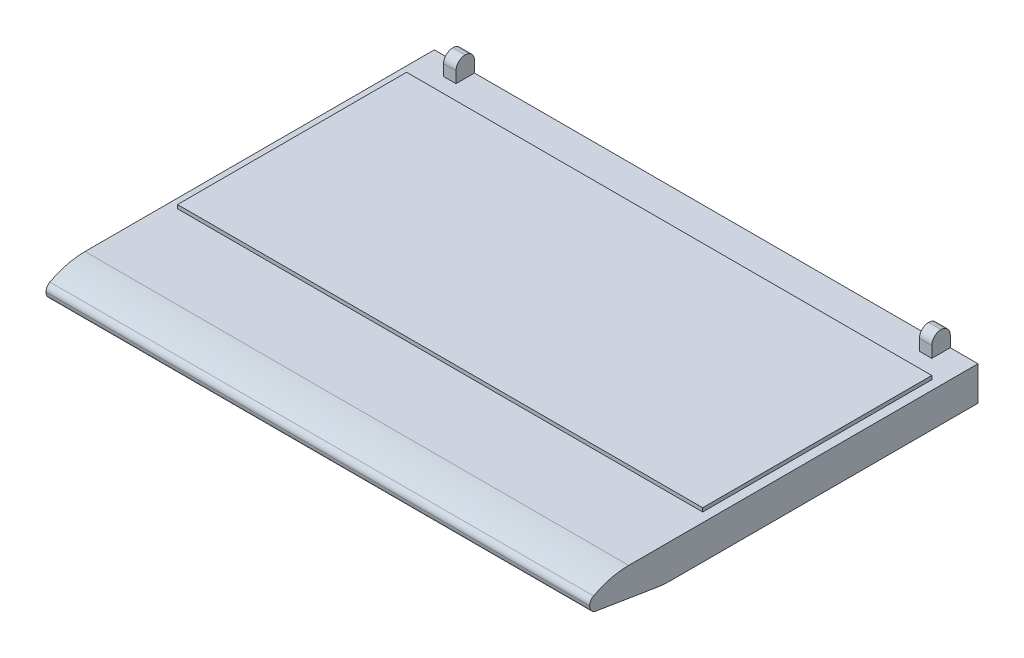
ISO-10303-21;
HEADER;
FILE_DESCRIPTION(('STEP AP214'),'2;1');
FILE_NAME('part.step','',(''),(''),'','','');
FILE_SCHEMA(('AUTOMOTIVE_DESIGN { 1 0 10303 214 1 1 1 1 }'));
ENDSEC;
DATA;
#1=APPLICATION_CONTEXT('core data for automotive mechanical design processes');
#2=APPLICATION_PROTOCOL_DEFINITION('international standard','automotive_design',2000,#1);
#3=PRODUCT_CONTEXT('',#1,'mechanical');
#4=PRODUCT('Part','Part','',(#3));
#5=PRODUCT_RELATED_PRODUCT_CATEGORY('part','',(#4));
#6=PRODUCT_DEFINITION_FORMATION('','',#4);
#7=PRODUCT_DEFINITION_CONTEXT('part definition',#1,'design');
#8=PRODUCT_DEFINITION('design','',#6,#7);
#9=PRODUCT_DEFINITION_SHAPE('','',#8);
#10=(LENGTH_UNIT() NAMED_UNIT(*) SI_UNIT(.MILLI.,.METRE.));
#11=(NAMED_UNIT(*) PLANE_ANGLE_UNIT() SI_UNIT($,.RADIAN.));
#12=(NAMED_UNIT(*) SI_UNIT($,.STERADIAN.) SOLID_ANGLE_UNIT());
#13=UNCERTAINTY_MEASURE_WITH_UNIT(LENGTH_MEASURE(1.E-05),#10,'distance_accuracy_value','');
#14=(GEOMETRIC_REPRESENTATION_CONTEXT(3) GLOBAL_UNCERTAINTY_ASSIGNED_CONTEXT((#13)) GLOBAL_UNIT_ASSIGNED_CONTEXT((#10,
#11,#12)) REPRESENTATION_CONTEXT('',''));
#15=CARTESIAN_POINT('',(0.,0.,0.));
#16=DIRECTION('',(0.,0.,1.));
#17=DIRECTION('',(1.,0.,0.));
#18=AXIS2_PLACEMENT_3D('',#15,#16,#17);
#19=CARTESIAN_POINT('',(147.,18.5,105.));
#20=DIRECTION('',(0.,-1.,0.));
#21=DIRECTION('',(0.,0.,-1.));
#22=AXIS2_PLACEMENT_3D('',#19,#20,#21);
#23=PLANE('',#22);
#24=DIRECTION('',(0.,0.,1.));
#25=VECTOR('',#24,1.);
#26=CARTESIAN_POINT('',(-132.,18.5,-105.));
#27=LINE('',#26,#25);
#28=CARTESIAN_POINT('',(-132.,18.5,-105.));
#29=VERTEX_POINT('',#28);
#30=CARTESIAN_POINT('',(-132.,18.5,-95.));
#31=VERTEX_POINT('',#30);
#32=EDGE_CURVE('E216',#29,#31,#27,.T.);
#33=ORIENTED_EDGE('',*,*,#32,.F.);
#34=DIRECTION('',(-1.,0.,0.));
#35=VECTOR('',#34,1.);
#36=CARTESIAN_POINT('',(147.,18.5,-105.));
#37=LINE('',#36,#35);
#38=CARTESIAN_POINT('',(-147.,18.5,-105.));
#39=VERTEX_POINT('',#38);
#40=EDGE_CURVE('E257',#29,#39,#37,.T.);
#41=ORIENTED_EDGE('',*,*,#40,.T.);
#42=DIRECTION('',(0.,0.,1.));
#43=VECTOR('',#42,1.);
#44=CARTESIAN_POINT('',(-147.,18.5,-105.));
#45=LINE('',#44,#43);
#46=CARTESIAN_POINT('',(-147.,18.5,83.8897274573419));
#47=VERTEX_POINT('',#46);
#48=EDGE_CURVE('E262',#39,#47,#45,.T.);
#49=ORIENTED_EDGE('',*,*,#48,.T.);
#50=DIRECTION('',(-1.,0.,0.));
#51=VECTOR('',#50,1.);
#52=CARTESIAN_POINT('',(147.,18.5,83.8897274573419));
#53=LINE('',#52,#51);
#54=CARTESIAN_POINT('',(147.,18.5,83.8897274573419));
#55=VERTEX_POINT('',#54);
#56=EDGE_CURVE('E283',#47,#55,#53,.F.);
#57=ORIENTED_EDGE('',*,*,#56,.T.);
#58=DIRECTION('',(0.,0.,-1.));
#59=VECTOR('',#58,1.);
#60=CARTESIAN_POINT('',(147.,18.5,-105.));
#61=LINE('',#60,#59);
#62=CARTESIAN_POINT('',(147.,18.5,-105.));
#63=VERTEX_POINT('',#62);
#64=EDGE_CURVE('E255',#55,#63,#61,.T.);
#65=ORIENTED_EDGE('',*,*,#64,.T.);
#66=CARTESIAN_POINT('',(132.,18.5,-105.));
#67=VERTEX_POINT('',#66);
#68=EDGE_CURVE('E259',#63,#67,#37,.T.);
#69=ORIENTED_EDGE('',*,*,#68,.T.);
#70=DIRECTION('',(0.,0.,-1.));
#71=VECTOR('',#70,1.);
#72=CARTESIAN_POINT('',(132.,18.5,-105.));
#73=LINE('',#72,#71);
#74=CARTESIAN_POINT('',(132.,18.5,-95.));
#75=VERTEX_POINT('',#74);
#76=EDGE_CURVE('E239',#75,#67,#73,.T.);
#77=ORIENTED_EDGE('',*,*,#76,.F.);
#78=DIRECTION('',(1.,0.,0.));
#79=VECTOR('',#78,1.);
#80=CARTESIAN_POINT('',(125.3,18.5,-95.0000000000001));
#81=LINE('',#80,#79);
#82=CARTESIAN_POINT('',(125.3,18.5,-95.0000000000001));
#83=VERTEX_POINT('',#82);
#84=EDGE_CURVE('E236',#83,#75,#81,.T.);
#85=ORIENTED_EDGE('',*,*,#84,.F.);
#86=DIRECTION('',(0.,0.,1.));
#87=VECTOR('',#86,1.);
#88=CARTESIAN_POINT('',(125.3,18.5,-105.));
#89=LINE('',#88,#87);
#90=CARTESIAN_POINT('',(125.3,18.5,-105.));
#91=VERTEX_POINT('',#90);
#92=EDGE_CURVE('E233',#91,#83,#89,.T.);
#93=ORIENTED_EDGE('',*,*,#92,.F.);
#94=CARTESIAN_POINT('',(-125.3,18.5,-105.));
#95=VERTEX_POINT('',#94);
#96=EDGE_CURVE('E263',#91,#95,#37,.T.);
#97=ORIENTED_EDGE('',*,*,#96,.T.);
#98=DIRECTION('',(0.,0.,-1.));
#99=VECTOR('',#98,1.);
#100=CARTESIAN_POINT('',(-125.3,18.5,-105.));
#101=LINE('',#100,#99);
#102=CARTESIAN_POINT('',(-125.3,18.5,-95.));
#103=VERTEX_POINT('',#102);
#104=EDGE_CURVE('E222',#103,#95,#101,.T.);
#105=ORIENTED_EDGE('',*,*,#104,.F.);
#106=DIRECTION('',(1.,0.,0.));
#107=VECTOR('',#106,1.);
#108=CARTESIAN_POINT('',(-125.3,18.5,-95.));
#109=LINE('',#108,#107);
#110=EDGE_CURVE('E219',#31,#103,#109,.T.);
#111=ORIENTED_EDGE('',*,*,#110,.F.);
#112=EDGE_LOOP('',(#33,#41,#49,#57,#65,#69,#77,#85,#93,#97,#105,#111));
#113=FACE_BOUND('',#112,.T.);
#114=DIRECTION('',(0.,0.,1.));
#115=VECTOR('',#114,1.);
#116=CARTESIAN_POINT('',(-142.,18.5,-85.));
#117=LINE('',#116,#115);
#118=CARTESIAN_POINT('',(-142.,18.5,-85.));
#119=VERTEX_POINT('',#118);
#120=CARTESIAN_POINT('',(-142.,18.5,38.8897274573419));
#121=VERTEX_POINT('',#120);
#122=EDGE_CURVE('E208',#119,#121,#117,.T.);
#123=ORIENTED_EDGE('',*,*,#122,.F.);
#124=DIRECTION('',(-1.,0.,0.));
#125=VECTOR('',#124,1.);
#126=CARTESIAN_POINT('',(-142.,18.5,-85.));
#127=LINE('',#126,#125);
#128=CARTESIAN_POINT('',(142.,18.5,-85.0000000000001));
#129=VERTEX_POINT('',#128);
#130=EDGE_CURVE('E205',#129,#119,#127,.T.);
#131=ORIENTED_EDGE('',*,*,#130,.F.);
#132=DIRECTION('',(0.,0.,-1.));
#133=VECTOR('',#132,1.);
#134=CARTESIAN_POINT('',(142.,18.5,-85.));
#135=LINE('',#134,#133);
#136=CARTESIAN_POINT('',(142.,18.5,38.8897274573419));
#137=VERTEX_POINT('',#136);
#138=EDGE_CURVE('E54',#137,#129,#135,.T.);
#139=ORIENTED_EDGE('',*,*,#138,.F.);
#140=DIRECTION('',(1.,0.,0.));
#141=VECTOR('',#140,1.);
#142=CARTESIAN_POINT('',(-142.,18.5,38.8897274573419));
#143=LINE('',#142,#141);
#144=EDGE_CURVE('E49',#121,#137,#143,.T.);
#145=ORIENTED_EDGE('',*,*,#144,.F.);
#146=EDGE_LOOP('',(#123,#131,#139,#145));
#147=FACE_BOUND('',#146,.T.);
#148=ADVANCED_FACE('F32',(#113,#147),#23,.F.);
#149=CARTESIAN_POINT('',(147.,18.5,-105.));
#150=DIRECTION('',(-1.,0.,0.));
#151=DIRECTION('',(0.,0.,1.));
#152=AXIS2_PLACEMENT_3D('',#149,#150,#151);
#153=PLANE('',#152);
#154=DIRECTION('',(0.,0.160396069376391,0.987052734623943));
#155=VECTOR('',#154,1.);
#156=CARTESIAN_POINT('',(147.,6.5,105.));
#157=LINE('',#156,#155);
#158=CARTESIAN_POINT('',(147.,0.647363268802846,68.9837739618637));
#159=VERTEX_POINT('',#158);
#160=CARTESIAN_POINT('',(147.,5.95425744509465,101.641584277506));
#161=VERTEX_POINT('',#160);
#162=EDGE_CURVE('E250',#159,#161,#157,.T.);
#163=ORIENTED_EDGE('',*,*,#162,.F.);
#164=CARTESIAN_POINT('',(147.,50.,60.9639704930441));
#165=DIRECTION('',(-1.,0.,0.));
#166=DIRECTION('',(0.,0.,1.));
#167=AXIS2_PLACEMENT_3D('',#164,#165,#166);
#168=CIRCLE('',#167,50.);
#169=CARTESIAN_POINT('',(147.,0.,60.9639704930441));
#170=VERTEX_POINT('',#169);
#171=EDGE_CURVE('E314',#159,#170,#168,.F.);
#172=ORIENTED_EDGE('',*,*,#171,.T.);
#173=DIRECTION('',(0.,0.,-1.));
#174=VECTOR('',#173,1.);
#175=CARTESIAN_POINT('',(147.,0.,-105.));
#176=LINE('',#175,#174);
#177=CARTESIAN_POINT('',(147.,0.,-105.));
#178=VERTEX_POINT('',#177);
#179=EDGE_CURVE('E254',#170,#178,#176,.T.);
#180=ORIENTED_EDGE('',*,*,#179,.T.);
#181=DIRECTION('',(0.,-1.,0.));
#182=VECTOR('',#181,1.);
#183=CARTESIAN_POINT('',(147.,18.5,-105.));
#184=LINE('',#183,#182);
#185=EDGE_CURVE('E280',#63,#178,#184,.T.);
#186=ORIENTED_EDGE('',*,*,#185,.F.);
#187=ORIENTED_EDGE('',*,*,#64,.F.);
#188=CARTESIAN_POINT('',(147.,-21.5,83.8897274573419));
#189=DIRECTION('',(-1.,0.,0.));
#190=DIRECTION('',(0.,0.,1.));
#191=AXIS2_PLACEMENT_3D('',#188,#189,#190);
#192=CIRCLE('',#191,40.);
#193=CARTESIAN_POINT('',(147.,13.693268392452,102.901141393629));
#194=VERTEX_POINT('',#193);
#195=EDGE_CURVE('E286',#55,#194,#192,.F.);
#196=ORIENTED_EDGE('',*,*,#195,.T.);
#197=CARTESIAN_POINT('',(147.,10.1739415532068,101.));
#198=DIRECTION('',(-1.,0.,0.));
#199=DIRECTION('',(0.,0.,1.));
#200=AXIS2_PLACEMENT_3D('',#197,#198,#199);
#201=CIRCLE('',#200,4.);
#202=CARTESIAN_POINT('',(147.,10.1739415532068,105.));
#203=VERTEX_POINT('',#202);
#204=EDGE_CURVE('E297',#194,#203,#201,.F.);
#205=ORIENTED_EDGE('',*,*,#204,.T.);
#206=DIRECTION('',(0.,-1.,0.));
#207=VECTOR('',#206,1.);
#208=CARTESIAN_POINT('',(147.,18.5,105.));
#209=LINE('',#208,#207);
#210=CARTESIAN_POINT('',(147.,9.90246838359042,105.));
#211=VERTEX_POINT('',#210);
#212=EDGE_CURVE('E266',#203,#211,#209,.T.);
#213=ORIENTED_EDGE('',*,*,#212,.T.);
#214=CARTESIAN_POINT('',(147.,9.90246838359042,101.));
#215=DIRECTION('',(-1.,0.,0.));
#216=DIRECTION('',(0.,0.,1.));
#217=AXIS2_PLACEMENT_3D('',#214,#215,#216);
#218=CIRCLE('',#217,4.);
#219=EDGE_CURVE('E299',#211,#161,#218,.F.);
#220=ORIENTED_EDGE('',*,*,#219,.T.);
#221=EDGE_LOOP('',(#163,#172,#180,#186,#187,#196,#205,#213,#220));
#222=FACE_BOUND('',#221,.T.);
#223=ADVANCED_FACE('F408',(#222),#153,.F.);
#224=CARTESIAN_POINT('',(147.,18.5,-105.));
#225=DIRECTION('',(0.,0.,1.));
#226=DIRECTION('',(1.,0.,0.));
#227=AXIS2_PLACEMENT_3D('',#224,#225,#226);
#228=PLANE('',#227);
#229=DIRECTION('',(0.,-1.,0.));
#230=VECTOR('',#229,1.);
#231=CARTESIAN_POINT('',(-132.,29.5,-105.));
#232=LINE('',#231,#230);
#233=CARTESIAN_POINT('',(-132.,24.5,-105.));
#234=VERTEX_POINT('',#233);
#235=EDGE_CURVE('E231',#234,#29,#232,.T.);
#236=ORIENTED_EDGE('',*,*,#235,.F.);
#237=DIRECTION('',(-1.,0.,0.));
#238=VECTOR('',#237,1.);
#239=CARTESIAN_POINT('',(-125.3,24.5,-105.));
#240=LINE('',#239,#238);
#241=CARTESIAN_POINT('',(-125.3,24.5,-105.));
#242=VERTEX_POINT('',#241);
#243=EDGE_CURVE('E327',#234,#242,#240,.F.);
#244=ORIENTED_EDGE('',*,*,#243,.T.);
#245=DIRECTION('',(0.,-1.,0.));
#246=VECTOR('',#245,1.);
#247=CARTESIAN_POINT('',(-125.3,29.5,-105.));
#248=LINE('',#247,#246);
#249=EDGE_CURVE('E225',#242,#95,#248,.T.);
#250=ORIENTED_EDGE('',*,*,#249,.T.);
#251=ORIENTED_EDGE('',*,*,#96,.F.);
#252=DIRECTION('',(0.,-1.,0.));
#253=VECTOR('',#252,1.);
#254=CARTESIAN_POINT('',(125.3,29.5,-105.));
#255=LINE('',#254,#253);
#256=CARTESIAN_POINT('',(125.3,24.5,-105.));
#257=VERTEX_POINT('',#256);
#258=EDGE_CURVE('E242',#257,#91,#255,.T.);
#259=ORIENTED_EDGE('',*,*,#258,.F.);
#260=DIRECTION('',(-1.,0.,0.));
#261=VECTOR('',#260,1.);
#262=CARTESIAN_POINT('',(132.,24.5,-105.));
#263=LINE('',#262,#261);
#264=CARTESIAN_POINT('',(132.,24.5,-105.));
#265=VERTEX_POINT('',#264);
#266=EDGE_CURVE('E324',#257,#265,#263,.F.);
#267=ORIENTED_EDGE('',*,*,#266,.T.);
#268=DIRECTION('',(0.,-1.,0.));
#269=VECTOR('',#268,1.);
#270=CARTESIAN_POINT('',(132.,29.5,-105.));
#271=LINE('',#270,#269);
#272=EDGE_CURVE('E244',#265,#67,#271,.T.);
#273=ORIENTED_EDGE('',*,*,#272,.T.);
#274=ORIENTED_EDGE('',*,*,#68,.F.);
#275=ORIENTED_EDGE('',*,*,#185,.T.);
#276=DIRECTION('',(-1.,0.,0.));
#277=VECTOR('',#276,1.);
#278=CARTESIAN_POINT('',(147.,0.,-105.));
#279=LINE('',#278,#277);
#280=CARTESIAN_POINT('',(-147.,0.,-105.));
#281=VERTEX_POINT('',#280);
#282=EDGE_CURVE('E268',#178,#281,#279,.T.);
#283=ORIENTED_EDGE('',*,*,#282,.T.);
#284=DIRECTION('',(0.,-1.,0.));
#285=VECTOR('',#284,1.);
#286=CARTESIAN_POINT('',(-147.,18.5,-105.));
#287=LINE('',#286,#285);
#288=EDGE_CURVE('E277',#39,#281,#287,.T.);
#289=ORIENTED_EDGE('',*,*,#288,.F.);
#290=ORIENTED_EDGE('',*,*,#40,.F.);
#291=EDGE_LOOP('',(#236,#244,#250,#251,#259,#267,#273,#274,#275,#283,#289,#290));
#292=FACE_BOUND('',#291,.T.);
#293=ADVANCED_FACE('F371',(#292),#228,.F.);
#294=CARTESIAN_POINT('',(-147.,18.5,-105.));
#295=DIRECTION('',(1.,0.,0.));
#296=DIRECTION('',(0.,0.,-1.));
#297=AXIS2_PLACEMENT_3D('',#294,#295,#296);
#298=PLANE('',#297);
#299=DIRECTION('',(0.,0.,1.));
#300=VECTOR('',#299,1.);
#301=CARTESIAN_POINT('',(-147.,0.,-105.));
#302=LINE('',#301,#300);
#303=CARTESIAN_POINT('',(-147.,0.,60.9639704930441));
#304=VERTEX_POINT('',#303);
#305=EDGE_CURVE('E258',#281,#304,#302,.T.);
#306=ORIENTED_EDGE('',*,*,#305,.T.);
#307=CARTESIAN_POINT('',(-147.,50.,60.9639704930441));
#308=DIRECTION('',(1.,0.,0.));
#309=DIRECTION('',(0.,0.,-1.));
#310=AXIS2_PLACEMENT_3D('',#307,#308,#309);
#311=CIRCLE('',#310,50.);
#312=CARTESIAN_POINT('',(-147.,0.64736326880285,68.9837739618637));
#313=VERTEX_POINT('',#312);
#314=EDGE_CURVE('E318',#304,#313,#311,.F.);
#315=ORIENTED_EDGE('',*,*,#314,.T.);
#316=DIRECTION('',(0.,0.160396069376391,0.987052734623943));
#317=VECTOR('',#316,1.);
#318=CARTESIAN_POINT('',(-147.,-26.4383467803319,-97.6975186481961));
#319=LINE('',#318,#317);
#320=CARTESIAN_POINT('',(-147.,5.95425744509465,101.641584277506));
#321=VERTEX_POINT('',#320);
#322=EDGE_CURVE('E252',#313,#321,#319,.T.);
#323=ORIENTED_EDGE('',*,*,#322,.T.);
#324=CARTESIAN_POINT('',(-147.,9.90246838359042,101.));
#325=DIRECTION('',(1.,0.,0.));
#326=DIRECTION('',(0.,0.,-1.));
#327=AXIS2_PLACEMENT_3D('',#324,#325,#326);
#328=CIRCLE('',#327,4.);
#329=CARTESIAN_POINT('',(-147.,9.90246838359042,105.));
#330=VERTEX_POINT('',#329);
#331=EDGE_CURVE('E307',#321,#330,#328,.F.);
#332=ORIENTED_EDGE('',*,*,#331,.T.);
#333=DIRECTION('',(0.,-1.,0.));
#334=VECTOR('',#333,1.);
#335=CARTESIAN_POINT('',(-147.,18.5,105.));
#336=LINE('',#335,#334);
#337=CARTESIAN_POINT('',(-147.,10.1739415532068,105.));
#338=VERTEX_POINT('',#337);
#339=EDGE_CURVE('E274',#338,#330,#336,.T.);
#340=ORIENTED_EDGE('',*,*,#339,.F.);
#341=CARTESIAN_POINT('',(-147.,10.1739415532068,101.));
#342=DIRECTION('',(1.,0.,0.));
#343=DIRECTION('',(0.,0.,-1.));
#344=AXIS2_PLACEMENT_3D('',#341,#342,#343);
#345=CIRCLE('',#344,4.);
#346=CARTESIAN_POINT('',(-147.,13.693268392452,102.901141393629));
#347=VERTEX_POINT('',#346);
#348=EDGE_CURVE('E305',#338,#347,#345,.F.);
#349=ORIENTED_EDGE('',*,*,#348,.T.);
#350=CARTESIAN_POINT('',(-147.,-21.5,83.8897274573419));
#351=DIRECTION('',(1.,0.,0.));
#352=DIRECTION('',(0.,0.,-1.));
#353=AXIS2_PLACEMENT_3D('',#350,#351,#352);
#354=CIRCLE('',#353,40.);
#355=EDGE_CURVE('E289',#347,#47,#354,.F.);
#356=ORIENTED_EDGE('',*,*,#355,.T.);
#357=ORIENTED_EDGE('',*,*,#48,.F.);
#358=ORIENTED_EDGE('',*,*,#288,.T.);
#359=EDGE_LOOP('',(#306,#315,#323,#332,#340,#349,#356,#357,#358));
#360=FACE_BOUND('',#359,.T.);
#361=ADVANCED_FACE('F424',(#360),#298,.F.);
#362=CARTESIAN_POINT('',(147.,18.5,105.));
#363=DIRECTION('',(0.,0.,-1.));
#364=DIRECTION('',(-1.,0.,0.));
#365=AXIS2_PLACEMENT_3D('',#362,#363,#364);
#366=PLANE('',#365);
#367=ORIENTED_EDGE('',*,*,#339,.T.);
#368=DIRECTION('',(1.,0.,0.));
#369=VECTOR('',#368,1.);
#370=CARTESIAN_POINT('',(147.,9.90246838359042,105.));
#371=LINE('',#370,#369);
#372=EDGE_CURVE('E294',#330,#211,#371,.T.);
#373=ORIENTED_EDGE('',*,*,#372,.T.);
#374=ORIENTED_EDGE('',*,*,#212,.F.);
#375=DIRECTION('',(-1.,0.,0.));
#376=VECTOR('',#375,1.);
#377=CARTESIAN_POINT('',(-147.,10.1739415532068,105.));
#378=LINE('',#377,#376);
#379=EDGE_CURVE('E291',#203,#338,#378,.T.);
#380=ORIENTED_EDGE('',*,*,#379,.T.);
#381=EDGE_LOOP('',(#367,#373,#374,#380));
#382=FACE_BOUND('',#381,.T.);
#383=ADVANCED_FACE('F420',(#382),#366,.F.);
#384=CARTESIAN_POINT('',(147.,0.,105.));
#385=DIRECTION('',(0.,-1.,0.));
#386=DIRECTION('',(0.,0.,-1.));
#387=AXIS2_PLACEMENT_3D('',#384,#385,#386);
#388=PLANE('',#387);
#389=ORIENTED_EDGE('',*,*,#179,.F.);
#390=DIRECTION('',(1.,0.,0.));
#391=VECTOR('',#390,1.);
#392=CARTESIAN_POINT('',(-147.,0.,60.9639704930441));
#393=LINE('',#392,#391);
#394=EDGE_CURVE('E316',#170,#304,#393,.F.);
#395=ORIENTED_EDGE('',*,*,#394,.T.);
#396=ORIENTED_EDGE('',*,*,#305,.F.);
#397=ORIENTED_EDGE('',*,*,#282,.F.);
#398=EDGE_LOOP('',(#389,#395,#396,#397));
#399=FACE_BOUND('',#398,.T.);
#400=ADVANCED_FACE('F417',(#399),#388,.T.);
#401=CARTESIAN_POINT('',(-153.,6.5,105.));
#402=DIRECTION('',(0.,0.987052734623943,-0.160396069376391));
#403=DIRECTION('',(0.,0.160396069376391,0.987052734623943));
#404=AXIS2_PLACEMENT_3D('',#401,#402,#403);
#405=PLANE('',#404);
#406=ORIENTED_EDGE('',*,*,#322,.F.);
#407=DIRECTION('',(1.,0.,0.));
#408=VECTOR('',#407,1.);
#409=CARTESIAN_POINT('',(147.,0.647363268802847,68.9837739618637));
#410=LINE('',#409,#408);
#411=EDGE_CURVE('E311',#313,#159,#410,.T.);
#412=ORIENTED_EDGE('',*,*,#411,.T.);
#413=ORIENTED_EDGE('',*,*,#162,.T.);
#414=DIRECTION('',(1.,0.,0.));
#415=VECTOR('',#414,1.);
#416=CARTESIAN_POINT('',(-153.,5.95425744509465,101.641584277506));
#417=LINE('',#416,#415);
#418=EDGE_CURVE('E302',#161,#321,#417,.F.);
#419=ORIENTED_EDGE('',*,*,#418,.T.);
#420=EDGE_LOOP('',(#406,#412,#413,#419));
#421=FACE_BOUND('',#420,.T.);
#422=ADVANCED_FACE('F416',(#421),#405,.F.);
#423=CARTESIAN_POINT('',(147.,-21.5,83.8897274573419));
#424=DIRECTION('',(1.,0.,0.));
#425=DIRECTION('',(0.,0.,-1.));
#426=AXIS2_PLACEMENT_3D('',#423,#424,#425);
#427=CYLINDRICAL_SURFACE('',#426,40.);
#428=ORIENTED_EDGE('',*,*,#355,.F.);
#429=DIRECTION('',(1.,0.,0.));
#430=VECTOR('',#429,1.);
#431=CARTESIAN_POINT('',(147.,13.693268392452,102.901141393629));
#432=LINE('',#431,#430);
#433=EDGE_CURVE('E309',#347,#194,#432,.T.);
#434=ORIENTED_EDGE('',*,*,#433,.T.);
#435=ORIENTED_EDGE('',*,*,#195,.F.);
#436=ORIENTED_EDGE('',*,*,#56,.F.);
#437=EDGE_LOOP('',(#428,#434,#435,#436));
#438=FACE_BOUND('',#437,.T.);
#439=ADVANCED_FACE('F431',(#438),#427,.T.);
#440=CARTESIAN_POINT('',(147.,9.90246838359042,101.));
#441=DIRECTION('',(1.,0.,0.));
#442=DIRECTION('',(0.,0.,-1.));
#443=AXIS2_PLACEMENT_3D('',#440,#441,#442);
#444=CYLINDRICAL_SURFACE('',#443,4.);
#445=ORIENTED_EDGE('',*,*,#331,.F.);
#446=ORIENTED_EDGE('',*,*,#418,.F.);
#447=ORIENTED_EDGE('',*,*,#219,.F.);
#448=ORIENTED_EDGE('',*,*,#372,.F.);
#449=EDGE_LOOP('',(#445,#446,#447,#448));
#450=FACE_BOUND('',#449,.T.);
#451=ADVANCED_FACE('F434',(#450),#444,.T.);
#452=CARTESIAN_POINT('',(147.,10.1739415532068,101.));
#453=DIRECTION('',(1.,0.,0.));
#454=DIRECTION('',(0.,0.,-1.));
#455=AXIS2_PLACEMENT_3D('',#452,#453,#454);
#456=CYLINDRICAL_SURFACE('',#455,4.);
#457=ORIENTED_EDGE('',*,*,#204,.F.);
#458=ORIENTED_EDGE('',*,*,#433,.F.);
#459=ORIENTED_EDGE('',*,*,#348,.F.);
#460=ORIENTED_EDGE('',*,*,#379,.F.);
#461=EDGE_LOOP('',(#457,#458,#459,#460));
#462=FACE_BOUND('',#461,.T.);
#463=ADVANCED_FACE('F403',(#462),#456,.T.);
#464=CARTESIAN_POINT('',(-153.,50.,60.9639704930441));
#465=DIRECTION('',(-1.,0.,0.));
#466=DIRECTION('',(0.,0.,1.));
#467=AXIS2_PLACEMENT_3D('',#464,#465,#466);
#468=CYLINDRICAL_SURFACE('',#467,50.);
#469=ORIENTED_EDGE('',*,*,#314,.F.);
#470=ORIENTED_EDGE('',*,*,#394,.F.);
#471=ORIENTED_EDGE('',*,*,#171,.F.);
#472=ORIENTED_EDGE('',*,*,#411,.F.);
#473=EDGE_LOOP('',(#469,#470,#471,#472));
#474=FACE_BOUND('',#473,.T.);
#475=ADVANCED_FACE('F396',(#474),#468,.T.);
#476=CARTESIAN_POINT('',(125.3,29.5,-105.));
#477=DIRECTION('',(1.,0.,0.));
#478=DIRECTION('',(0.,0.,-1.));
#479=AXIS2_PLACEMENT_3D('',#476,#477,#478);
#480=PLANE('',#479);
#481=CARTESIAN_POINT('',(125.3,24.5,-100.));
#482=DIRECTION('',(1.,0.,0.));
#483=DIRECTION('',(0.,0.,-1.));
#484=AXIS2_PLACEMENT_3D('',#481,#482,#483);
#485=CIRCLE('',#484,5.);
#486=CARTESIAN_POINT('',(125.3,24.5,-95.0000000000001));
#487=VERTEX_POINT('',#486);
#488=CARTESIAN_POINT('',(125.3,29.5,-100.));
#489=VERTEX_POINT('',#488);
#490=EDGE_CURVE('E336',#487,#489,#485,.F.);
#491=ORIENTED_EDGE('',*,*,#490,.T.);
#492=CARTESIAN_POINT('',(125.3,24.5,-100.));
#493=DIRECTION('',(1.,0.,0.));
#494=DIRECTION('',(0.,0.,-1.));
#495=AXIS2_PLACEMENT_3D('',#492,#493,#494);
#496=CIRCLE('',#495,5.);
#497=EDGE_CURVE('E338',#489,#257,#496,.F.);
#498=ORIENTED_EDGE('',*,*,#497,.T.);
#499=ORIENTED_EDGE('',*,*,#258,.T.);
#500=ORIENTED_EDGE('',*,*,#92,.T.);
#501=DIRECTION('',(0.,-1.,0.));
#502=VECTOR('',#501,1.);
#503=CARTESIAN_POINT('',(125.3,29.5,-95.0000000000001));
#504=LINE('',#503,#502);
#505=EDGE_CURVE('E248',#487,#83,#504,.T.);
#506=ORIENTED_EDGE('',*,*,#505,.F.);
#507=EDGE_LOOP('',(#491,#498,#499,#500,#506));
#508=FACE_BOUND('',#507,.T.);
#509=ADVANCED_FACE('F394',(#508),#480,.F.);
#510=CARTESIAN_POINT('',(125.3,29.5,-95.0000000000001));
#511=DIRECTION('',(0.,0.,-1.));
#512=DIRECTION('',(-1.,0.,0.));
#513=AXIS2_PLACEMENT_3D('',#510,#511,#512);
#514=PLANE('',#513);
#515=DIRECTION('',(0.,-1.,0.));
#516=VECTOR('',#515,1.);
#517=CARTESIAN_POINT('',(132.,29.5,-95.0000000000001));
#518=LINE('',#517,#516);
#519=CARTESIAN_POINT('',(132.,24.5,-95.0000000000001));
#520=VERTEX_POINT('',#519);
#521=EDGE_CURVE('E246',#520,#75,#518,.T.);
#522=ORIENTED_EDGE('',*,*,#521,.F.);
#523=DIRECTION('',(1.,0.,0.));
#524=VECTOR('',#523,1.);
#525=CARTESIAN_POINT('',(125.3,24.5,-95.0000000000001));
#526=LINE('',#525,#524);
#527=EDGE_CURVE('E11',#520,#487,#526,.F.);
#528=ORIENTED_EDGE('',*,*,#527,.T.);
#529=ORIENTED_EDGE('',*,*,#505,.T.);
#530=ORIENTED_EDGE('',*,*,#84,.T.);
#531=EDGE_LOOP('',(#522,#528,#529,#530));
#532=FACE_BOUND('',#531,.T.);
#533=ADVANCED_FACE('F393',(#532),#514,.F.);
#534=CARTESIAN_POINT('',(132.,29.5,-105.));
#535=DIRECTION('',(-1.,0.,0.));
#536=DIRECTION('',(0.,0.,1.));
#537=AXIS2_PLACEMENT_3D('',#534,#535,#536);
#538=PLANE('',#537);
#539=ORIENTED_EDGE('',*,*,#272,.F.);
#540=CARTESIAN_POINT('',(132.,24.5,-100.));
#541=DIRECTION('',(-1.,0.,0.));
#542=DIRECTION('',(0.,0.,1.));
#543=AXIS2_PLACEMENT_3D('',#540,#541,#542);
#544=CIRCLE('',#543,5.);
#545=CARTESIAN_POINT('',(132.,29.5,-100.));
#546=VERTEX_POINT('',#545);
#547=EDGE_CURVE('E41',#265,#546,#544,.F.);
#548=ORIENTED_EDGE('',*,*,#547,.T.);
#549=CARTESIAN_POINT('',(132.,24.5,-100.));
#550=DIRECTION('',(-1.,0.,0.));
#551=DIRECTION('',(0.,0.,1.));
#552=AXIS2_PLACEMENT_3D('',#549,#550,#551);
#553=CIRCLE('',#552,5.);
#554=EDGE_CURVE('E340',#546,#520,#553,.F.);
#555=ORIENTED_EDGE('',*,*,#554,.T.);
#556=ORIENTED_EDGE('',*,*,#521,.T.);
#557=ORIENTED_EDGE('',*,*,#76,.T.);
#558=EDGE_LOOP('',(#539,#548,#555,#556,#557));
#559=FACE_BOUND('',#558,.T.);
#560=ADVANCED_FACE('F386',(#559),#538,.F.);
#561=CARTESIAN_POINT('',(-132.,29.5,-105.));
#562=DIRECTION('',(1.,0.,0.));
#563=DIRECTION('',(0.,0.,-1.));
#564=AXIS2_PLACEMENT_3D('',#561,#562,#563);
#565=PLANE('',#564);
#566=CARTESIAN_POINT('',(-132.,24.5,-100.));
#567=DIRECTION('',(1.,0.,0.));
#568=DIRECTION('',(0.,0.,-1.));
#569=AXIS2_PLACEMENT_3D('',#566,#567,#568);
#570=CIRCLE('',#569,5.);
#571=CARTESIAN_POINT('',(-132.,24.5,-95.));
#572=VERTEX_POINT('',#571);
#573=CARTESIAN_POINT('',(-132.,29.5,-100.));
#574=VERTEX_POINT('',#573);
#575=EDGE_CURVE('E320',#572,#574,#570,.F.);
#576=ORIENTED_EDGE('',*,*,#575,.T.);
#577=CARTESIAN_POINT('',(-132.,24.5,-100.));
#578=DIRECTION('',(1.,0.,0.));
#579=DIRECTION('',(0.,0.,-1.));
#580=AXIS2_PLACEMENT_3D('',#577,#578,#579);
#581=CIRCLE('',#580,5.);
#582=EDGE_CURVE('E322',#574,#234,#581,.F.);
#583=ORIENTED_EDGE('',*,*,#582,.T.);
#584=ORIENTED_EDGE('',*,*,#235,.T.);
#585=ORIENTED_EDGE('',*,*,#32,.T.);
#586=DIRECTION('',(0.,-1.,0.));
#587=VECTOR('',#586,1.);
#588=CARTESIAN_POINT('',(-132.,29.5,-95.));
#589=LINE('',#588,#587);
#590=EDGE_CURVE('E229',#572,#31,#589,.T.);
#591=ORIENTED_EDGE('',*,*,#590,.F.);
#592=EDGE_LOOP('',(#576,#583,#584,#585,#591));
#593=FACE_BOUND('',#592,.T.);
#594=ADVANCED_FACE('F366',(#593),#565,.F.);
#595=CARTESIAN_POINT('',(-125.3,29.5,-95.));
#596=DIRECTION('',(0.,0.,-1.));
#597=DIRECTION('',(-1.,0.,0.));
#598=AXIS2_PLACEMENT_3D('',#595,#596,#597);
#599=PLANE('',#598);
#600=DIRECTION('',(0.,-1.,0.));
#601=VECTOR('',#600,1.);
#602=CARTESIAN_POINT('',(-125.3,29.5,-95.));
#603=LINE('',#602,#601);
#604=CARTESIAN_POINT('',(-125.3,24.5,-95.));
#605=VERTEX_POINT('',#604);
#606=EDGE_CURVE('E227',#605,#103,#603,.T.);
#607=ORIENTED_EDGE('',*,*,#606,.F.);
#608=DIRECTION('',(1.,0.,0.));
#609=VECTOR('',#608,1.);
#610=CARTESIAN_POINT('',(-132.,24.5,-95.));
#611=LINE('',#610,#609);
#612=EDGE_CURVE('E334',#605,#572,#611,.F.);
#613=ORIENTED_EDGE('',*,*,#612,.T.);
#614=ORIENTED_EDGE('',*,*,#590,.T.);
#615=ORIENTED_EDGE('',*,*,#110,.T.);
#616=EDGE_LOOP('',(#607,#613,#614,#615));
#617=FACE_BOUND('',#616,.T.);
#618=ADVANCED_FACE('F359',(#617),#599,.F.);
#619=CARTESIAN_POINT('',(-125.3,29.5,-105.));
#620=DIRECTION('',(-1.,0.,0.));
#621=DIRECTION('',(0.,0.,1.));
#622=AXIS2_PLACEMENT_3D('',#619,#620,#621);
#623=PLANE('',#622);
#624=ORIENTED_EDGE('',*,*,#249,.F.);
#625=CARTESIAN_POINT('',(-125.3,24.5,-100.));
#626=DIRECTION('',(-1.,0.,0.));
#627=DIRECTION('',(0.,0.,1.));
#628=AXIS2_PLACEMENT_3D('',#625,#626,#627);
#629=CIRCLE('',#628,5.);
#630=CARTESIAN_POINT('',(-125.3,29.5,-100.));
#631=VERTEX_POINT('',#630);
#632=EDGE_CURVE('E332',#242,#631,#629,.F.);
#633=ORIENTED_EDGE('',*,*,#632,.T.);
#634=CARTESIAN_POINT('',(-125.3,24.5,-100.));
#635=DIRECTION('',(-1.,0.,0.));
#636=DIRECTION('',(0.,0.,1.));
#637=AXIS2_PLACEMENT_3D('',#634,#635,#636);
#638=CIRCLE('',#637,5.);
#639=EDGE_CURVE('E330',#631,#605,#638,.F.);
#640=ORIENTED_EDGE('',*,*,#639,.T.);
#641=ORIENTED_EDGE('',*,*,#606,.T.);
#642=ORIENTED_EDGE('',*,*,#104,.T.);
#643=EDGE_LOOP('',(#624,#633,#640,#641,#642));
#644=FACE_BOUND('',#643,.T.);
#645=ADVANCED_FACE('F356',(#644),#623,.F.);
#646=CARTESIAN_POINT('',(-132.,24.5,-100.));
#647=DIRECTION('',(-1.,0.,0.));
#648=DIRECTION('',(0.,0.,1.));
#649=AXIS2_PLACEMENT_3D('',#646,#647,#648);
#650=CYLINDRICAL_SURFACE('',#649,5.);
#651=ORIENTED_EDGE('',*,*,#612,.F.);
#652=ORIENTED_EDGE('',*,*,#639,.F.);
#653=DIRECTION('',(1.,0.,0.));
#654=VECTOR('',#653,1.);
#655=CARTESIAN_POINT('',(-125.3,29.5,-100.));
#656=LINE('',#655,#654);
#657=EDGE_CURVE('E211',#574,#631,#656,.T.);
#658=ORIENTED_EDGE('',*,*,#657,.F.);
#659=ORIENTED_EDGE('',*,*,#575,.F.);
#660=EDGE_LOOP('',(#651,#652,#658,#659));
#661=FACE_BOUND('',#660,.T.);
#662=ADVANCED_FACE('F352',(#661),#650,.T.);
#663=CARTESIAN_POINT('',(-132.,24.5,-100.));
#664=DIRECTION('',(1.,0.,0.));
#665=DIRECTION('',(0.,0.,-1.));
#666=AXIS2_PLACEMENT_3D('',#663,#664,#665);
#667=CYLINDRICAL_SURFACE('',#666,5.);
#668=ORIENTED_EDGE('',*,*,#632,.F.);
#669=ORIENTED_EDGE('',*,*,#243,.F.);
#670=ORIENTED_EDGE('',*,*,#582,.F.);
#671=ORIENTED_EDGE('',*,*,#657,.T.);
#672=EDGE_LOOP('',(#668,#669,#670,#671));
#673=FACE_BOUND('',#672,.T.);
#674=ADVANCED_FACE('F346',(#673),#667,.T.);
#675=CARTESIAN_POINT('',(125.3,24.5,-100.));
#676=DIRECTION('',(-1.,0.,0.));
#677=DIRECTION('',(0.,0.,1.));
#678=AXIS2_PLACEMENT_3D('',#675,#676,#677);
#679=CYLINDRICAL_SURFACE('',#678,5.);
#680=ORIENTED_EDGE('',*,*,#527,.F.);
#681=ORIENTED_EDGE('',*,*,#554,.F.);
#682=DIRECTION('',(1.,0.,0.));
#683=VECTOR('',#682,1.);
#684=CARTESIAN_POINT('',(132.,29.5,-100.));
#685=LINE('',#684,#683);
#686=EDGE_CURVE('E36',#489,#546,#685,.T.);
#687=ORIENTED_EDGE('',*,*,#686,.F.);
#688=ORIENTED_EDGE('',*,*,#490,.F.);
#689=EDGE_LOOP('',(#680,#681,#687,#688));
#690=FACE_BOUND('',#689,.T.);
#691=ADVANCED_FACE('F34',(#690),#679,.T.);
#692=CARTESIAN_POINT('',(125.3,24.5,-100.));
#693=DIRECTION('',(1.,0.,0.));
#694=DIRECTION('',(0.,0.,-1.));
#695=AXIS2_PLACEMENT_3D('',#692,#693,#694);
#696=CYLINDRICAL_SURFACE('',#695,5.);
#697=ORIENTED_EDGE('',*,*,#547,.F.);
#698=ORIENTED_EDGE('',*,*,#266,.F.);
#699=ORIENTED_EDGE('',*,*,#497,.F.);
#700=ORIENTED_EDGE('',*,*,#686,.T.);
#701=EDGE_LOOP('',(#697,#698,#699,#700));
#702=FACE_BOUND('',#701,.T.);
#703=ADVANCED_FACE('F382',(#702),#696,.T.);
#704=CARTESIAN_POINT('',(-142.,20.5,-85.));
#705=DIRECTION('',(1.,0.,0.));
#706=DIRECTION('',(0.,0.,-1.));
#707=AXIS2_PLACEMENT_3D('',#704,#705,#706);
#708=PLANE('',#707);
#709=ORIENTED_EDGE('',*,*,#122,.T.);
#710=DIRECTION('',(0.,-1.,0.));
#711=VECTOR('',#710,1.);
#712=CARTESIAN_POINT('',(-142.,20.5,38.8897274573419));
#713=LINE('',#712,#711);
#714=CARTESIAN_POINT('',(-142.,20.5,38.8897274573419));
#715=VERTEX_POINT('',#714);
#716=EDGE_CURVE('E189',#715,#121,#713,.T.);
#717=ORIENTED_EDGE('',*,*,#716,.F.);
#718=DIRECTION('',(0.,0.,1.));
#719=VECTOR('',#718,1.);
#720=CARTESIAN_POINT('',(-142.,20.5,-85.));
#721=LINE('',#720,#719);
#722=CARTESIAN_POINT('',(-142.,20.5,-85.));
#723=VERTEX_POINT('',#722);
#724=EDGE_CURVE('E196',#723,#715,#721,.T.);
#725=ORIENTED_EDGE('',*,*,#724,.F.);
#726=DIRECTION('',(0.,-1.,0.));
#727=VECTOR('',#726,1.);
#728=CARTESIAN_POINT('',(-142.,20.5,-85.));
#729=LINE('',#728,#727);
#730=EDGE_CURVE('E653',#723,#119,#729,.T.);
#731=ORIENTED_EDGE('',*,*,#730,.T.);
#732=EDGE_LOOP('',(#709,#717,#725,#731));
#733=FACE_BOUND('',#732,.T.);
#734=ADVANCED_FACE('F207',(#733),#708,.F.);
#735=CARTESIAN_POINT('',(-142.,20.5,38.8897274573419));
#736=DIRECTION('',(0.,0.,-1.));
#737=DIRECTION('',(-1.,0.,0.));
#738=AXIS2_PLACEMENT_3D('',#735,#736,#737);
#739=PLANE('',#738);
#740=ORIENTED_EDGE('',*,*,#144,.T.);
#741=DIRECTION('',(0.,-1.,0.));
#742=VECTOR('',#741,1.);
#743=CARTESIAN_POINT('',(142.,20.5,38.8897274573419));
#744=LINE('',#743,#742);
#745=CARTESIAN_POINT('',(142.,20.5,38.8897274573419));
#746=VERTEX_POINT('',#745);
#747=EDGE_CURVE('E192',#746,#137,#744,.T.);
#748=ORIENTED_EDGE('',*,*,#747,.F.);
#749=DIRECTION('',(1.,0.,0.));
#750=VECTOR('',#749,1.);
#751=CARTESIAN_POINT('',(-142.,20.5,38.8897274573419));
#752=LINE('',#751,#750);
#753=EDGE_CURVE('E185',#715,#746,#752,.T.);
#754=ORIENTED_EDGE('',*,*,#753,.F.);
#755=ORIENTED_EDGE('',*,*,#716,.T.);
#756=EDGE_LOOP('',(#740,#748,#754,#755));
#757=FACE_BOUND('',#756,.T.);
#758=ADVANCED_FACE('F187',(#757),#739,.F.);
#759=CARTESIAN_POINT('',(142.,20.5,-85.));
#760=DIRECTION('',(-1.,0.,0.));
#761=DIRECTION('',(0.,0.,1.));
#762=AXIS2_PLACEMENT_3D('',#759,#760,#761);
#763=PLANE('',#762);
#764=ORIENTED_EDGE('',*,*,#138,.T.);
#765=DIRECTION('',(0.,-1.,0.));
#766=VECTOR('',#765,1.);
#767=CARTESIAN_POINT('',(142.,20.5,-85.));
#768=LINE('',#767,#766);
#769=CARTESIAN_POINT('',(142.,20.5,-85.));
#770=VERTEX_POINT('',#769);
#771=EDGE_CURVE('E212',#770,#129,#768,.T.);
#772=ORIENTED_EDGE('',*,*,#771,.F.);
#773=DIRECTION('',(0.,0.,-1.));
#774=VECTOR('',#773,1.);
#775=CARTESIAN_POINT('',(142.,20.5,-85.));
#776=LINE('',#775,#774);
#777=EDGE_CURVE('E195',#746,#770,#776,.T.);
#778=ORIENTED_EDGE('',*,*,#777,.F.);
#779=ORIENTED_EDGE('',*,*,#747,.T.);
#780=EDGE_LOOP('',(#764,#772,#778,#779));
#781=FACE_BOUND('',#780,.T.);
#782=ADVANCED_FACE('F620',(#781),#763,.F.);
#783=CARTESIAN_POINT('',(-142.,20.5,-85.));
#784=DIRECTION('',(0.,0.,1.));
#785=DIRECTION('',(1.,0.,0.));
#786=AXIS2_PLACEMENT_3D('',#783,#784,#785);
#787=PLANE('',#786);
#788=ORIENTED_EDGE('',*,*,#130,.T.);
#789=ORIENTED_EDGE('',*,*,#730,.F.);
#790=DIRECTION('',(-1.,0.,0.));
#791=VECTOR('',#790,1.);
#792=CARTESIAN_POINT('',(-142.,20.5,-85.));
#793=LINE('',#792,#791);
#794=EDGE_CURVE('E201',#770,#723,#793,.T.);
#795=ORIENTED_EDGE('',*,*,#794,.F.);
#796=ORIENTED_EDGE('',*,*,#771,.T.);
#797=EDGE_LOOP('',(#788,#789,#795,#796));
#798=FACE_BOUND('',#797,.T.);
#799=ADVANCED_FACE('F628',(#798),#787,.F.);
#800=CARTESIAN_POINT('',(-142.,20.5,38.8897274573419));
#801=DIRECTION('',(0.,1.,0.));
#802=DIRECTION('',(0.,0.,1.));
#803=AXIS2_PLACEMENT_3D('',#800,#801,#802);
#804=PLANE('',#803);
#805=ORIENTED_EDGE('',*,*,#724,.T.);
#806=ORIENTED_EDGE('',*,*,#753,.T.);
#807=ORIENTED_EDGE('',*,*,#777,.T.);
#808=ORIENTED_EDGE('',*,*,#794,.T.);
#809=EDGE_LOOP('',(#805,#806,#807,#808));
#810=FACE_BOUND('',#809,.T.);
#811=ADVANCED_FACE('F199',(#810),#804,.T.);
#812=CLOSED_SHELL('',(#148,#223,#293,#361,#383,#400,#422,#439,#451,#463,#475,#509,#533,#560,
#594,#618,#645,#662,#674,#691,#703,#734,#758,#782,#799,#811));
#813=MANIFOLD_SOLID_BREP('B2',#812);
#814=ADVANCED_BREP_SHAPE_REPRESENTATION('',(#18,#813),#14);
#815=SHAPE_DEFINITION_REPRESENTATION(#9,#814);
ENDSEC;
END-ISO-10303-21;
